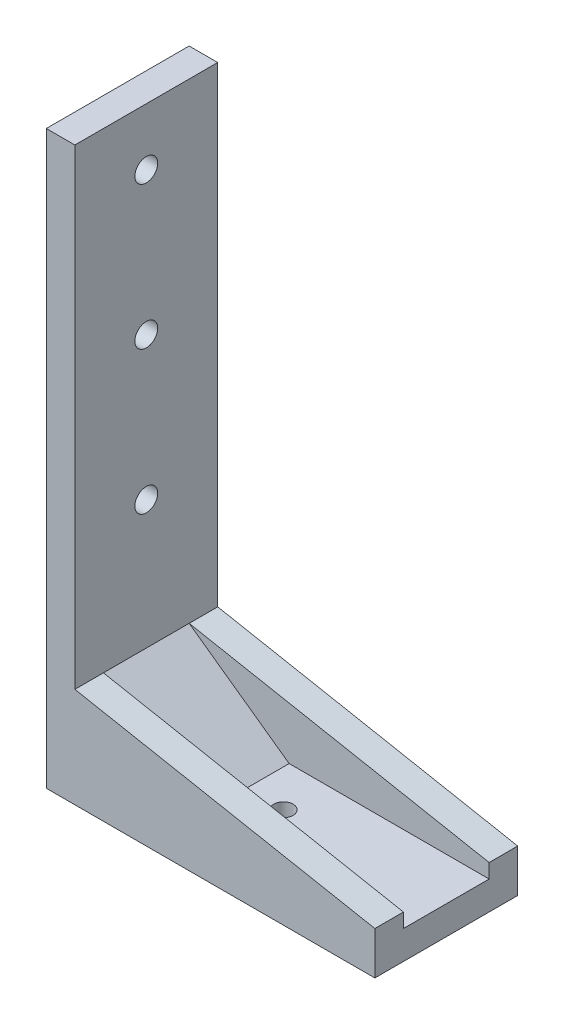
ISO-10303-21;
HEADER;
FILE_DESCRIPTION(('STEP AP214'),'2;1');
FILE_NAME('part.step','',(''),(''),'','','');
FILE_SCHEMA(('AUTOMOTIVE_DESIGN { 1 0 10303 214 1 1 1 1 }'));
ENDSEC;
DATA;
#1=APPLICATION_CONTEXT('core data for automotive mechanical design processes');
#2=APPLICATION_PROTOCOL_DEFINITION('international standard','automotive_design',2000,#1);
#3=PRODUCT_CONTEXT('',#1,'mechanical');
#4=PRODUCT('Part','Part','',(#3));
#5=PRODUCT_RELATED_PRODUCT_CATEGORY('part','',(#4));
#6=PRODUCT_DEFINITION_FORMATION('','',#4);
#7=PRODUCT_DEFINITION_CONTEXT('part definition',#1,'design');
#8=PRODUCT_DEFINITION('design','',#6,#7);
#9=PRODUCT_DEFINITION_SHAPE('','',#8);
#10=(LENGTH_UNIT() NAMED_UNIT(*) SI_UNIT(.MILLI.,.METRE.));
#11=(NAMED_UNIT(*) PLANE_ANGLE_UNIT() SI_UNIT($,.RADIAN.));
#12=(NAMED_UNIT(*) SI_UNIT($,.STERADIAN.) SOLID_ANGLE_UNIT());
#13=UNCERTAINTY_MEASURE_WITH_UNIT(LENGTH_MEASURE(1.E-05),#10,'distance_accuracy_value','');
#14=(GEOMETRIC_REPRESENTATION_CONTEXT(3) GLOBAL_UNCERTAINTY_ASSIGNED_CONTEXT((#13)) GLOBAL_UNIT_ASSIGNED_CONTEXT((#10,
#11,#12)) REPRESENTATION_CONTEXT('',''));
#15=CARTESIAN_POINT('',(0.,0.,0.));
#16=DIRECTION('',(0.,0.,1.));
#17=DIRECTION('',(1.,0.,0.));
#18=AXIS2_PLACEMENT_3D('',#15,#16,#17);
#19=CARTESIAN_POINT('',(0.,0.,25.));
#20=DIRECTION('',(0.,1.,0.));
#21=DIRECTION('',(0.,0.,1.));
#22=AXIS2_PLACEMENT_3D('',#19,#20,#21);
#23=PLANE('',#22);
#24=CARTESIAN_POINT('',(57.9999999999991,0.,-3.18807500671113E-13));
#25=DIRECTION('',(0.,-1.,0.));
#26=DIRECTION('',(0.,0.,-1.));
#27=AXIS2_PLACEMENT_3D('',#24,#25,#26);
#28=CIRCLE('',#27,3.39999999999998);
#29=CARTESIAN_POINT('',(57.9999999999991,0.,-3.4000000000003));
#30=VERTEX_POINT('',#29);
#31=EDGE_CURVE('E152',#30,#30,#28,.T.);
#32=ORIENTED_EDGE('',*,*,#31,.F.);
#33=EDGE_LOOP('',(#32));
#34=FACE_BOUND('',#33,.T.);
#35=DIRECTION('',(1.,0.,0.));
#36=VECTOR('',#35,1.);
#37=CARTESIAN_POINT('',(0.,0.,-25.));
#38=LINE('',#37,#36);
#39=CARTESIAN_POINT('',(0.,0.,-25.));
#40=VERTEX_POINT('',#39);
#41=CARTESIAN_POINT('',(115.,0.,-25.));
#42=VERTEX_POINT('',#41);
#43=EDGE_CURVE('E162',#40,#42,#38,.T.);
#44=ORIENTED_EDGE('',*,*,#43,.T.);
#45=DIRECTION('',(0.,0.,-1.));
#46=VECTOR('',#45,1.);
#47=CARTESIAN_POINT('',(115.,0.,25.));
#48=LINE('',#47,#46);
#49=CARTESIAN_POINT('',(115.,0.,25.));
#50=VERTEX_POINT('',#49);
#51=EDGE_CURVE('E208',#50,#42,#48,.T.);
#52=ORIENTED_EDGE('',*,*,#51,.F.);
#53=DIRECTION('',(1.,0.,0.));
#54=VECTOR('',#53,1.);
#55=CARTESIAN_POINT('',(0.,0.,25.));
#56=LINE('',#55,#54);
#57=CARTESIAN_POINT('',(0.,0.,25.));
#58=VERTEX_POINT('',#57);
#59=EDGE_CURVE('E177',#58,#50,#56,.T.);
#60=ORIENTED_EDGE('',*,*,#59,.F.);
#61=DIRECTION('',(0.,0.,-1.));
#62=VECTOR('',#61,1.);
#63=CARTESIAN_POINT('',(0.,0.,25.));
#64=LINE('',#63,#62);
#65=EDGE_CURVE('E189',#58,#40,#64,.T.);
#66=ORIENTED_EDGE('',*,*,#65,.T.);
#67=EDGE_LOOP('',(#44,#52,#60,#66));
#68=FACE_BOUND('',#67,.T.);
#69=ADVANCED_FACE('F33',(#34,#68),#23,.F.);
#70=CARTESIAN_POINT('',(115.,0.,25.));
#71=DIRECTION('',(-1.,0.,0.));
#72=DIRECTION('',(0.,0.,1.));
#73=AXIS2_PLACEMENT_3D('',#70,#71,#72);
#74=PLANE('',#73);
#75=DIRECTION('',(0.,1.,0.));
#76=VECTOR('',#75,1.);
#77=CARTESIAN_POINT('',(115.,0.,-25.));
#78=LINE('',#77,#76);
#79=CARTESIAN_POINT('',(115.,15.,-25.));
#80=VERTEX_POINT('',#79);
#81=EDGE_CURVE('E192',#42,#80,#78,.T.);
#82=ORIENTED_EDGE('',*,*,#81,.T.);
#83=DIRECTION('',(0.,0.,-1.));
#84=VECTOR('',#83,1.);
#85=CARTESIAN_POINT('',(115.,15.,-15.));
#86=LINE('',#85,#84);
#87=CARTESIAN_POINT('',(115.,15.,-15.));
#88=VERTEX_POINT('',#87);
#89=EDGE_CURVE('E139',#88,#80,#86,.T.);
#90=ORIENTED_EDGE('',*,*,#89,.F.);
#91=DIRECTION('',(0.,-1.,0.));
#92=VECTOR('',#91,1.);
#93=CARTESIAN_POINT('',(115.,10.,-15.));
#94=LINE('',#93,#92);
#95=CARTESIAN_POINT('',(115.,10.,-15.));
#96=VERTEX_POINT('',#95);
#97=EDGE_CURVE('E135',#88,#96,#94,.T.);
#98=ORIENTED_EDGE('',*,*,#97,.T.);
#99=DIRECTION('',(0.,0.,-1.));
#100=VECTOR('',#99,1.);
#101=CARTESIAN_POINT('',(115.,10.,25.));
#102=LINE('',#101,#100);
#103=CARTESIAN_POINT('',(115.,10.,15.));
#104=VERTEX_POINT('',#103);
#105=EDGE_CURVE('E114',#104,#96,#102,.T.);
#106=ORIENTED_EDGE('',*,*,#105,.F.);
#107=DIRECTION('',(0.,-1.,0.));
#108=VECTOR('',#107,1.);
#109=CARTESIAN_POINT('',(115.,10.,15.));
#110=LINE('',#109,#108);
#111=CARTESIAN_POINT('',(115.,15.,15.));
#112=VERTEX_POINT('',#111);
#113=EDGE_CURVE('E107',#112,#104,#110,.T.);
#114=ORIENTED_EDGE('',*,*,#113,.F.);
#115=DIRECTION('',(0.,0.,1.));
#116=VECTOR('',#115,1.);
#117=CARTESIAN_POINT('',(115.,15.,15.));
#118=LINE('',#117,#116);
#119=CARTESIAN_POINT('',(115.,15.,25.));
#120=VERTEX_POINT('',#119);
#121=EDGE_CURVE('E111',#112,#120,#118,.T.);
#122=ORIENTED_EDGE('',*,*,#121,.T.);
#123=DIRECTION('',(0.,1.,0.));
#124=VECTOR('',#123,1.);
#125=CARTESIAN_POINT('',(115.,0.,25.));
#126=LINE('',#125,#124);
#127=EDGE_CURVE('E180',#50,#120,#126,.T.);
#128=ORIENTED_EDGE('',*,*,#127,.F.);
#129=ORIENTED_EDGE('',*,*,#51,.T.);
#130=EDGE_LOOP('',(#82,#90,#98,#106,#114,#122,#128,#129));
#131=FACE_BOUND('',#130,.T.);
#132=ADVANCED_FACE('F109',(#131),#74,.F.);
#133=CARTESIAN_POINT('',(115.,10.,25.));
#134=DIRECTION('',(0.,-1.,0.));
#135=DIRECTION('',(1.,0.,0.));
#136=AXIS2_PLACEMENT_3D('',#133,#134,#135);
#137=PLANE('',#136);
#138=CARTESIAN_POINT('',(57.9999999999991,10.,-3.18807500671113E-13));
#139=DIRECTION('',(0.,-1.,0.));
#140=DIRECTION('',(1.,0.,0.));
#141=AXIS2_PLACEMENT_3D('',#138,#139,#140);
#142=CIRCLE('',#141,3.39999999999998);
#143=CARTESIAN_POINT('',(57.9999999999991,10.,-3.4000000000003));
#144=VERTEX_POINT('',#143);
#145=EDGE_CURVE('E155',#144,#144,#142,.F.);
#146=ORIENTED_EDGE('',*,*,#145,.F.);
#147=EDGE_LOOP('',(#146));
#148=FACE_BOUND('',#147,.T.);
#149=DIRECTION('',(0.,0.,-1.));
#150=VECTOR('',#149,1.);
#151=CARTESIAN_POINT('',(45.,10.,68.0116263352131));
#152=LINE('',#151,#150);
#153=CARTESIAN_POINT('',(45.,10.,15.));
#154=VERTEX_POINT('',#153);
#155=CARTESIAN_POINT('',(45.,10.,-15.));
#156=VERTEX_POINT('',#155);
#157=EDGE_CURVE('E150',#154,#156,#152,.T.);
#158=ORIENTED_EDGE('',*,*,#157,.F.);
#159=DIRECTION('',(-1.,0.,0.));
#160=VECTOR('',#159,1.);
#161=CARTESIAN_POINT('',(115.,10.,15.));
#162=LINE('',#161,#160);
#163=EDGE_CURVE('E47',#104,#154,#162,.T.);
#164=ORIENTED_EDGE('',*,*,#163,.F.);
#165=ORIENTED_EDGE('',*,*,#105,.T.);
#166=DIRECTION('',(-1.,0.,0.));
#167=VECTOR('',#166,1.);
#168=CARTESIAN_POINT('',(115.,10.,-15.));
#169=LINE('',#168,#167);
#170=EDGE_CURVE('E137',#96,#156,#169,.T.);
#171=ORIENTED_EDGE('',*,*,#170,.T.);
#172=EDGE_LOOP('',(#158,#164,#165,#171));
#173=FACE_BOUND('',#172,.T.);
#174=ADVANCED_FACE('F217',(#148,#173),#137,.F.);
#175=CARTESIAN_POINT('',(10.,9.99999999999999,25.));
#176=DIRECTION('',(-1.,0.,0.));
#177=DIRECTION('',(0.,0.,1.));
#178=AXIS2_PLACEMENT_3D('',#175,#176,#177);
#179=PLANE('',#178);
#180=CARTESIAN_POINT('',(10.,180.,0.));
#181=DIRECTION('',(1.,0.,0.));
#182=DIRECTION('',(0.,0.,-1.));
#183=AXIS2_PLACEMENT_3D('',#180,#181,#182);
#184=CIRCLE('',#183,4.);
#185=CARTESIAN_POINT('',(10.,180.,-4.));
#186=VERTEX_POINT('',#185);
#187=EDGE_CURVE('E163',#186,#186,#184,.T.);
#188=ORIENTED_EDGE('',*,*,#187,.F.);
#189=EDGE_LOOP('',(#188));
#190=FACE_BOUND('',#189,.T.);
#191=CARTESIAN_POINT('',(10.,130.,0.));
#192=DIRECTION('',(1.,0.,0.));
#193=DIRECTION('',(0.,0.,-1.));
#194=AXIS2_PLACEMENT_3D('',#191,#192,#193);
#195=CIRCLE('',#194,4.);
#196=CARTESIAN_POINT('',(10.,130.,-4.));
#197=VERTEX_POINT('',#196);
#198=EDGE_CURVE('E169',#197,#197,#195,.T.);
#199=ORIENTED_EDGE('',*,*,#198,.F.);
#200=EDGE_LOOP('',(#199));
#201=FACE_BOUND('',#200,.T.);
#202=CARTESIAN_POINT('',(10.,80.,0.));
#203=DIRECTION('',(1.,0.,0.));
#204=DIRECTION('',(0.,0.,-1.));
#205=AXIS2_PLACEMENT_3D('',#202,#203,#204);
#206=CIRCLE('',#205,4.);
#207=CARTESIAN_POINT('',(10.,80.,-4.));
#208=VERTEX_POINT('',#207);
#209=EDGE_CURVE('E158',#208,#208,#206,.T.);
#210=ORIENTED_EDGE('',*,*,#209,.F.);
#211=EDGE_LOOP('',(#210));
#212=FACE_BOUND('',#211,.T.);
#213=DIRECTION('',(0.,1.,0.));
#214=VECTOR('',#213,1.);
#215=CARTESIAN_POINT('',(10.,9.99999999999999,25.));
#216=LINE('',#215,#214);
#217=CARTESIAN_POINT('',(10.,35.,25.));
#218=VERTEX_POINT('',#217);
#219=CARTESIAN_POINT('',(10.,200.,25.));
#220=VERTEX_POINT('',#219);
#221=EDGE_CURVE('E183',#218,#220,#216,.T.);
#222=ORIENTED_EDGE('',*,*,#221,.F.);
#223=DIRECTION('',(0.,0.,-1.));
#224=VECTOR('',#223,1.);
#225=CARTESIAN_POINT('',(10.,35.,68.0116263352131));
#226=LINE('',#225,#224);
#227=CARTESIAN_POINT('',(10.,35.,15.));
#228=VERTEX_POINT('',#227);
#229=EDGE_CURVE('E147',#218,#228,#226,.T.);
#230=ORIENTED_EDGE('',*,*,#229,.T.);
#231=CARTESIAN_POINT('',(10.,35.,-15.));
#232=VERTEX_POINT('',#231);
#233=EDGE_CURVE('E144',#228,#232,#226,.T.);
#234=ORIENTED_EDGE('',*,*,#233,.T.);
#235=DIRECTION('',(0.,0.,-1.));
#236=VECTOR('',#235,1.);
#237=CARTESIAN_POINT('',(10.,35.,-15.));
#238=LINE('',#237,#236);
#239=CARTESIAN_POINT('',(10.,35.,-25.));
#240=VERTEX_POINT('',#239);
#241=EDGE_CURVE('E141',#232,#240,#238,.T.);
#242=ORIENTED_EDGE('',*,*,#241,.T.);
#243=DIRECTION('',(0.,1.,0.));
#244=VECTOR('',#243,1.);
#245=CARTESIAN_POINT('',(10.,9.99999999999999,-25.));
#246=LINE('',#245,#244);
#247=CARTESIAN_POINT('',(10.,200.,-25.));
#248=VERTEX_POINT('',#247);
#249=EDGE_CURVE('E194',#240,#248,#246,.T.);
#250=ORIENTED_EDGE('',*,*,#249,.T.);
#251=DIRECTION('',(0.,0.,-1.));
#252=VECTOR('',#251,1.);
#253=CARTESIAN_POINT('',(10.,200.,25.));
#254=LINE('',#253,#252);
#255=EDGE_CURVE('E204',#220,#248,#254,.T.);
#256=ORIENTED_EDGE('',*,*,#255,.F.);
#257=EDGE_LOOP('',(#222,#230,#234,#242,#250,#256));
#258=FACE_BOUND('',#257,.T.);
#259=ADVANCED_FACE('F262',(#190,#201,#212,#258),#179,.F.);
#260=CARTESIAN_POINT('',(10.,200.,25.));
#261=DIRECTION('',(0.,-1.,0.));
#262=DIRECTION('',(0.,0.,-1.));
#263=AXIS2_PLACEMENT_3D('',#260,#261,#262);
#264=PLANE('',#263);
#265=DIRECTION('',(-1.,0.,0.));
#266=VECTOR('',#265,1.);
#267=CARTESIAN_POINT('',(10.,200.,-25.));
#268=LINE('',#267,#266);
#269=CARTESIAN_POINT('',(0.,200.,-25.));
#270=VERTEX_POINT('',#269);
#271=EDGE_CURVE('E196',#248,#270,#268,.T.);
#272=ORIENTED_EDGE('',*,*,#271,.T.);
#273=DIRECTION('',(0.,0.,-1.));
#274=VECTOR('',#273,1.);
#275=CARTESIAN_POINT('',(0.,200.,25.));
#276=LINE('',#275,#274);
#277=CARTESIAN_POINT('',(0.,200.,25.));
#278=VERTEX_POINT('',#277);
#279=EDGE_CURVE('E201',#278,#270,#276,.T.);
#280=ORIENTED_EDGE('',*,*,#279,.F.);
#281=DIRECTION('',(-1.,0.,0.));
#282=VECTOR('',#281,1.);
#283=CARTESIAN_POINT('',(10.,200.,25.));
#284=LINE('',#283,#282);
#285=EDGE_CURVE('E185',#220,#278,#284,.T.);
#286=ORIENTED_EDGE('',*,*,#285,.F.);
#287=ORIENTED_EDGE('',*,*,#255,.T.);
#288=EDGE_LOOP('',(#272,#280,#286,#287));
#289=FACE_BOUND('',#288,.T.);
#290=ADVANCED_FACE('F259',(#289),#264,.F.);
#291=CARTESIAN_POINT('',(0.,0.,25.));
#292=DIRECTION('',(1.,0.,0.));
#293=DIRECTION('',(0.,0.,-1.));
#294=AXIS2_PLACEMENT_3D('',#291,#292,#293);
#295=PLANE('',#294);
#296=CARTESIAN_POINT('',(0.,180.,0.));
#297=DIRECTION('',(1.,0.,0.));
#298=DIRECTION('',(0.,0.,-1.));
#299=AXIS2_PLACEMENT_3D('',#296,#297,#298);
#300=CIRCLE('',#299,4.);
#301=CARTESIAN_POINT('',(0.,180.,-4.));
#302=VERTEX_POINT('',#301);
#303=EDGE_CURVE('E159',#302,#302,#300,.T.);
#304=ORIENTED_EDGE('',*,*,#303,.T.);
#305=EDGE_LOOP('',(#304));
#306=FACE_BOUND('',#305,.T.);
#307=CARTESIAN_POINT('',(0.,130.,0.));
#308=DIRECTION('',(1.,0.,0.));
#309=DIRECTION('',(0.,0.,-1.));
#310=AXIS2_PLACEMENT_3D('',#307,#308,#309);
#311=CIRCLE('',#310,4.);
#312=CARTESIAN_POINT('',(0.,130.,-4.));
#313=VERTEX_POINT('',#312);
#314=EDGE_CURVE('E166',#313,#313,#311,.T.);
#315=ORIENTED_EDGE('',*,*,#314,.T.);
#316=EDGE_LOOP('',(#315));
#317=FACE_BOUND('',#316,.T.);
#318=CARTESIAN_POINT('',(0.,80.,0.));
#319=DIRECTION('',(1.,0.,0.));
#320=DIRECTION('',(0.,0.,-1.));
#321=AXIS2_PLACEMENT_3D('',#318,#319,#320);
#322=CIRCLE('',#321,4.);
#323=CARTESIAN_POINT('',(0.,80.,-4.));
#324=VERTEX_POINT('',#323);
#325=EDGE_CURVE('E172',#324,#324,#322,.T.);
#326=ORIENTED_EDGE('',*,*,#325,.T.);
#327=EDGE_LOOP('',(#326));
#328=FACE_BOUND('',#327,.T.);
#329=DIRECTION('',(0.,-1.,0.));
#330=VECTOR('',#329,1.);
#331=CARTESIAN_POINT('',(0.,0.,-25.));
#332=LINE('',#331,#330);
#333=EDGE_CURVE('E181',#270,#40,#332,.T.);
#334=ORIENTED_EDGE('',*,*,#333,.T.);
#335=ORIENTED_EDGE('',*,*,#65,.F.);
#336=DIRECTION('',(0.,-1.,0.));
#337=VECTOR('',#336,1.);
#338=CARTESIAN_POINT('',(0.,0.,25.));
#339=LINE('',#338,#337);
#340=EDGE_CURVE('E187',#278,#58,#339,.T.);
#341=ORIENTED_EDGE('',*,*,#340,.F.);
#342=ORIENTED_EDGE('',*,*,#279,.T.);
#343=EDGE_LOOP('',(#334,#335,#341,#342));
#344=FACE_BOUND('',#343,.T.);
#345=ADVANCED_FACE('F257',(#306,#317,#328,#344),#295,.F.);
#346=CARTESIAN_POINT('',(0.,0.,25.));
#347=DIRECTION('',(0.,0.,1.));
#348=DIRECTION('',(1.,0.,0.));
#349=AXIS2_PLACEMENT_3D('',#346,#347,#348);
#350=PLANE('',#349);
#351=ORIENTED_EDGE('',*,*,#127,.T.);
#352=DIRECTION('',(0.982338566422475,-0.187112107889995,0.));
#353=VECTOR('',#352,1.);
#354=CARTESIAN_POINT('',(10.,35.,25.));
#355=LINE('',#354,#353);
#356=EDGE_CURVE('E122',#218,#120,#355,.T.);
#357=ORIENTED_EDGE('',*,*,#356,.F.);
#358=ORIENTED_EDGE('',*,*,#221,.T.);
#359=ORIENTED_EDGE('',*,*,#285,.T.);
#360=ORIENTED_EDGE('',*,*,#340,.T.);
#361=ORIENTED_EDGE('',*,*,#59,.T.);
#362=EDGE_LOOP('',(#351,#357,#358,#359,#360,#361));
#363=FACE_BOUND('',#362,.T.);
#364=ADVANCED_FACE('F252',(#363),#350,.T.);
#365=CARTESIAN_POINT('',(0.,0.,-25.));
#366=DIRECTION('',(0.,0.,1.));
#367=DIRECTION('',(1.,0.,0.));
#368=AXIS2_PLACEMENT_3D('',#365,#366,#367);
#369=PLANE('',#368);
#370=ORIENTED_EDGE('',*,*,#249,.F.);
#371=DIRECTION('',(0.982338566422475,-0.187112107889995,0.));
#372=VECTOR('',#371,1.);
#373=CARTESIAN_POINT('',(10.,35.,-25.));
#374=LINE('',#373,#372);
#375=EDGE_CURVE('E126',#240,#80,#374,.T.);
#376=ORIENTED_EDGE('',*,*,#375,.T.);
#377=ORIENTED_EDGE('',*,*,#81,.F.);
#378=ORIENTED_EDGE('',*,*,#43,.F.);
#379=ORIENTED_EDGE('',*,*,#333,.F.);
#380=ORIENTED_EDGE('',*,*,#271,.F.);
#381=EDGE_LOOP('',(#370,#376,#377,#378,#379,#380));
#382=FACE_BOUND('',#381,.T.);
#383=ADVANCED_FACE('F249',(#382),#369,.F.);
#384=CARTESIAN_POINT('',(0.,80.,0.));
#385=DIRECTION('',(1.,0.,0.));
#386=DIRECTION('',(0.,0.,-1.));
#387=AXIS2_PLACEMENT_3D('',#384,#385,#386);
#388=CYLINDRICAL_SURFACE('',#387,4.);
#389=ORIENTED_EDGE('',*,*,#325,.F.);
#390=EDGE_LOOP('',(#389));
#391=FACE_BOUND('',#390,.T.);
#392=ORIENTED_EDGE('',*,*,#209,.T.);
#393=EDGE_LOOP('',(#392));
#394=FACE_BOUND('',#393,.T.);
#395=ADVANCED_FACE('F282',(#391,#394),#388,.F.);
#396=CARTESIAN_POINT('',(0.,130.,0.));
#397=DIRECTION('',(1.,0.,0.));
#398=DIRECTION('',(0.,0.,-1.));
#399=AXIS2_PLACEMENT_3D('',#396,#397,#398);
#400=CYLINDRICAL_SURFACE('',#399,4.);
#401=ORIENTED_EDGE('',*,*,#314,.F.);
#402=EDGE_LOOP('',(#401));
#403=FACE_BOUND('',#402,.T.);
#404=ORIENTED_EDGE('',*,*,#198,.T.);
#405=EDGE_LOOP('',(#404));
#406=FACE_BOUND('',#405,.T.);
#407=ADVANCED_FACE('F287',(#403,#406),#400,.F.);
#408=CARTESIAN_POINT('',(0.,180.,0.));
#409=DIRECTION('',(1.,0.,0.));
#410=DIRECTION('',(0.,0.,-1.));
#411=AXIS2_PLACEMENT_3D('',#408,#409,#410);
#412=CYLINDRICAL_SURFACE('',#411,4.);
#413=ORIENTED_EDGE('',*,*,#303,.F.);
#414=EDGE_LOOP('',(#413));
#415=FACE_BOUND('',#414,.T.);
#416=ORIENTED_EDGE('',*,*,#187,.T.);
#417=EDGE_LOOP('',(#416));
#418=FACE_BOUND('',#417,.T.);
#419=ADVANCED_FACE('F231',(#415,#418),#412,.F.);
#420=CARTESIAN_POINT('',(57.9999999999991,200.001,-3.18807500671113E-13));
#421=DIRECTION('',(0.,-1.,0.));
#422=DIRECTION('',(0.,0.,-1.));
#423=AXIS2_PLACEMENT_3D('',#420,#421,#422);
#424=CYLINDRICAL_SURFACE('',#423,3.39999999999998);
#425=CARTESIAN_POINT('',(57.9999999999991,0.,-3.4000000000003));
#426=CARTESIAN_POINT('',(57.9999999999991,0.104166666666664,-3.4000000000003));
#427=CARTESIAN_POINT('',(57.9999999999991,0.208333333333329,-3.4000000000003));
#428=CARTESIAN_POINT('',(57.9999999999991,0.416666666666658,-3.4000000000003));
#429=CARTESIAN_POINT('',(57.9999999999991,0.520833333333322,-3.4000000000003));
#430=CARTESIAN_POINT('',(57.9999999999991,0.72916666666666,-3.4000000000003));
#431=CARTESIAN_POINT('',(57.9999999999991,0.833333333333334,-3.4000000000003));
#432=CARTESIAN_POINT('',(57.9999999999991,1.04166666666667,-3.4000000000003));
#433=CARTESIAN_POINT('',(57.9999999999991,1.14583333333334,-3.4000000000003));
#434=CARTESIAN_POINT('',(57.9999999999991,1.35416666666667,-3.4000000000003));
#435=CARTESIAN_POINT('',(57.9999999999991,1.45833333333333,-3.4000000000003));
#436=CARTESIAN_POINT('',(57.9999999999991,1.66666666666667,-3.4000000000003));
#437=CARTESIAN_POINT('',(57.9999999999991,1.77083333333334,-3.4000000000003));
#438=CARTESIAN_POINT('',(57.9999999999991,1.97916666666668,-3.4000000000003));
#439=CARTESIAN_POINT('',(57.9999999999991,2.08333333333334,-3.4000000000003));
#440=CARTESIAN_POINT('',(57.9999999999991,2.29166666666667,-3.4000000000003));
#441=CARTESIAN_POINT('',(57.9999999999991,2.39583333333334,-3.4000000000003));
#442=CARTESIAN_POINT('',(57.9999999999991,2.60416666666667,-3.4000000000003));
#443=CARTESIAN_POINT('',(57.9999999999991,2.70833333333333,-3.4000000000003));
#444=CARTESIAN_POINT('',(57.9999999999991,2.91666666666666,-3.4000000000003));
#445=CARTESIAN_POINT('',(57.9999999999991,3.02083333333332,-3.4000000000003));
#446=CARTESIAN_POINT('',(57.9999999999991,3.22916666666666,-3.4000000000003));
#447=CARTESIAN_POINT('',(57.9999999999991,3.33333333333334,-3.4000000000003));
#448=CARTESIAN_POINT('',(57.9999999999991,3.54166666666667,-3.4000000000003));
#449=CARTESIAN_POINT('',(57.9999999999991,3.64583333333334,-3.4000000000003));
#450=CARTESIAN_POINT('',(57.9999999999991,3.85416666666667,-3.4000000000003));
#451=CARTESIAN_POINT('',(57.9999999999991,3.95833333333333,-3.4000000000003));
#452=CARTESIAN_POINT('',(57.9999999999991,4.16666666666667,-3.4000000000003));
#453=CARTESIAN_POINT('',(57.9999999999991,4.27083333333334,-3.4000000000003));
#454=CARTESIAN_POINT('',(57.9999999999991,4.47916666666668,-3.4000000000003));
#455=CARTESIAN_POINT('',(57.9999999999991,4.58333333333335,-3.4000000000003));
#456=CARTESIAN_POINT('',(57.9999999999991,4.79166666666668,-3.4000000000003));
#457=CARTESIAN_POINT('',(57.9999999999991,4.89583333333334,-3.4000000000003));
#458=CARTESIAN_POINT('',(57.9999999999991,5.10416666666667,-3.4000000000003));
#459=CARTESIAN_POINT('',(57.9999999999991,5.20833333333333,-3.4000000000003));
#460=CARTESIAN_POINT('',(57.9999999999991,5.41666666666666,-3.4000000000003));
#461=CARTESIAN_POINT('',(57.9999999999991,5.52083333333333,-3.4000000000003));
#462=CARTESIAN_POINT('',(57.9999999999991,5.72916666666666,-3.4000000000003));
#463=CARTESIAN_POINT('',(57.9999999999991,5.83333333333334,-3.4000000000003));
#464=CARTESIAN_POINT('',(57.9999999999991,6.04166666666668,-3.4000000000003));
#465=CARTESIAN_POINT('',(57.9999999999991,6.14583333333334,-3.4000000000003));
#466=CARTESIAN_POINT('',(57.9999999999991,6.35416666666667,-3.4000000000003));
#467=CARTESIAN_POINT('',(57.9999999999991,6.45833333333333,-3.4000000000003));
#468=CARTESIAN_POINT('',(57.9999999999991,6.66666666666667,-3.4000000000003));
#469=CARTESIAN_POINT('',(57.9999999999991,6.77083333333335,-3.4000000000003));
#470=CARTESIAN_POINT('',(57.9999999999991,6.97916666666668,-3.4000000000003));
#471=CARTESIAN_POINT('',(57.9999999999991,7.08333333333335,-3.4000000000003));
#472=CARTESIAN_POINT('',(57.9999999999991,7.29166666666668,-3.4000000000003));
#473=CARTESIAN_POINT('',(57.9999999999991,7.39583333333334,-3.4000000000003));
#474=CARTESIAN_POINT('',(57.9999999999991,7.60416666666667,-3.4000000000003));
#475=CARTESIAN_POINT('',(57.9999999999991,7.70833333333334,-3.4000000000003));
#476=CARTESIAN_POINT('',(57.9999999999991,7.91666666666666,-3.4000000000003));
#477=CARTESIAN_POINT('',(57.9999999999991,8.02083333333333,-3.4000000000003));
#478=CARTESIAN_POINT('',(57.9999999999991,8.22916666666667,-3.4000000000003));
#479=CARTESIAN_POINT('',(57.9999999999991,8.33333333333334,-3.4000000000003));
#480=CARTESIAN_POINT('',(57.9999999999991,8.54166666666668,-3.4000000000003));
#481=CARTESIAN_POINT('',(57.9999999999991,8.64583333333334,-3.4000000000003));
#482=CARTESIAN_POINT('',(57.9999999999991,8.85416666666667,-3.4000000000003));
#483=CARTESIAN_POINT('',(57.9999999999991,8.95833333333334,-3.4000000000003));
#484=CARTESIAN_POINT('',(57.9999999999991,9.16666666666667,-3.4000000000003));
#485=CARTESIAN_POINT('',(57.9999999999991,9.27083333333335,-3.4000000000003));
#486=CARTESIAN_POINT('',(57.9999999999991,9.47916666666669,-3.4000000000003));
#487=CARTESIAN_POINT('',(57.9999999999991,9.58333333333335,-3.4000000000003));
#488=CARTESIAN_POINT('',(57.9999999999991,9.79166666666668,-3.4000000000003));
#489=CARTESIAN_POINT('',(57.9999999999991,9.89583333333334,-3.4000000000003));
#490=CARTESIAN_POINT('',(57.9999999999991,10.,-3.4000000000003));
#491=B_SPLINE_CURVE_WITH_KNOTS('',3,(#425,#426,#427,#428,#429,#430,#431,#432,#433,#434,#435,
#436,#437,#438,#439,#440,#441,#442,#443,#444,#445,#446,#447,#448,#449,#450,#451,#452,#453,#454,
#455,#456,#457,#458,#459,#460,#461,#462,#463,#464,#465,#466,#467,#468,#469,#470,#471,#472,#473,
#474,#475,#476,#477,#478,#479,#480,#481,#482,#483,#484,#485,#486,#487,#488,#489,#490),
.UNSPECIFIED.,.F.,.F.,(4,2,2,2,2,2,2,2,2,2,2,2,2,2,2,2,2,2,2,2,2,2,2,2,2,2,2,2,2,2,2,2,4),(0.,
0.312499999999993,0.624999999999987,0.937500000000008,1.25,1.56249999999999,1.87500000000002,
2.18750000000001,2.5,2.8125,3.12499999999999,3.43750000000001,3.75,4.0625,4.37500000000002,
4.68750000000001,5.,5.3125,5.62499999999999,5.93750000000001,6.25000000000001,6.5625,
6.87500000000002,7.18750000000001,7.50000000000001,7.8125,8.12499999999999,8.43750000000001,
8.75000000000001,9.0625,9.37500000000002,9.68750000000002,10.),.UNSPECIFIED.);
#492=EDGE_CURVE('BSEAM222',#30,#144,#491,.T.);
#493=ORIENTED_EDGE('',*,*,#31,.T.);
#494=ORIENTED_EDGE('',*,*,#145,.T.);
#495=ORIENTED_EDGE('',*,*,#492,.T.);
#496=ORIENTED_EDGE('',*,*,#492,.F.);
#497=EDGE_LOOP('',(#493,#495,#494,#496));
#498=FACE_BOUND('',#497,.T.);
#499=ADVANCED_FACE('F222',(#498),#424,.F.);
#500=CARTESIAN_POINT('',(10.,35.,68.0116263352131));
#501=DIRECTION('',(0.581238193719096,0.813733471206735,0.));
#502=DIRECTION('',(-0.813733471206735,0.581238193719096,0.));
#503=AXIS2_PLACEMENT_3D('',#500,#501,#502);
#504=PLANE('',#503);
#505=DIRECTION('',(-0.813733471206735,0.581238193719096,0.));
#506=VECTOR('',#505,1.);
#507=CARTESIAN_POINT('',(10.,35.,15.));
#508=LINE('',#507,#506);
#509=EDGE_CURVE('E11',#154,#228,#508,.T.);
#510=ORIENTED_EDGE('',*,*,#509,.F.);
#511=ORIENTED_EDGE('',*,*,#157,.T.);
#512=DIRECTION('',(0.813733471206735,-0.581238193719096,0.));
#513=VECTOR('',#512,1.);
#514=CARTESIAN_POINT('',(10.,35.,-15.));
#515=LINE('',#514,#513);
#516=EDGE_CURVE('E40',#232,#156,#515,.T.);
#517=ORIENTED_EDGE('',*,*,#516,.F.);
#518=ORIENTED_EDGE('',*,*,#233,.F.);
#519=EDGE_LOOP('',(#510,#511,#517,#518));
#520=FACE_BOUND('',#519,.T.);
#521=ADVANCED_FACE('F219',(#520),#504,.T.);
#522=CARTESIAN_POINT('',(10.,35.,-15.));
#523=DIRECTION('',(0.187112107889995,0.982338566422475,0.));
#524=DIRECTION('',(-0.982338566422475,0.187112107889995,0.));
#525=AXIS2_PLACEMENT_3D('',#522,#523,#524);
#526=PLANE('',#525);
#527=ORIENTED_EDGE('',*,*,#375,.F.);
#528=ORIENTED_EDGE('',*,*,#241,.F.);
#529=DIRECTION('',(0.982338566422475,-0.187112107889995,0.));
#530=VECTOR('',#529,1.);
#531=CARTESIAN_POINT('',(10.,35.,-15.));
#532=LINE('',#531,#530);
#533=EDGE_CURVE('E129',#232,#88,#532,.T.);
#534=ORIENTED_EDGE('',*,*,#533,.T.);
#535=ORIENTED_EDGE('',*,*,#89,.T.);
#536=EDGE_LOOP('',(#527,#528,#534,#535));
#537=FACE_BOUND('',#536,.T.);
#538=ADVANCED_FACE('F221',(#537),#526,.T.);
#539=CARTESIAN_POINT('',(0.,0.,-15.));
#540=DIRECTION('',(0.,0.,1.));
#541=DIRECTION('',(1.,0.,0.));
#542=AXIS2_PLACEMENT_3D('',#539,#540,#541);
#543=PLANE('',#542);
#544=ORIENTED_EDGE('',*,*,#533,.F.);
#545=ORIENTED_EDGE('',*,*,#516,.T.);
#546=ORIENTED_EDGE('',*,*,#170,.F.);
#547=ORIENTED_EDGE('',*,*,#97,.F.);
#548=EDGE_LOOP('',(#544,#545,#546,#547));
#549=FACE_BOUND('',#548,.T.);
#550=ADVANCED_FACE('F215',(#549),#543,.T.);
#551=CARTESIAN_POINT('',(10.,35.,15.));
#552=DIRECTION('',(-0.187112107889995,-0.982338566422475,0.));
#553=DIRECTION('',(0.982338566422475,-0.187112107889995,0.));
#554=AXIS2_PLACEMENT_3D('',#551,#552,#553);
#555=PLANE('',#554);
#556=ORIENTED_EDGE('',*,*,#356,.T.);
#557=ORIENTED_EDGE('',*,*,#121,.F.);
#558=DIRECTION('',(0.982338566422475,-0.187112107889995,0.));
#559=VECTOR('',#558,1.);
#560=CARTESIAN_POINT('',(10.,35.,15.));
#561=LINE('',#560,#559);
#562=EDGE_CURVE('E118',#228,#112,#561,.T.);
#563=ORIENTED_EDGE('',*,*,#562,.F.);
#564=ORIENTED_EDGE('',*,*,#229,.F.);
#565=EDGE_LOOP('',(#556,#557,#563,#564));
#566=FACE_BOUND('',#565,.T.);
#567=ADVANCED_FACE('F124',(#566),#555,.F.);
#568=CARTESIAN_POINT('',(0.,0.,15.));
#569=DIRECTION('',(0.,0.,-1.));
#570=DIRECTION('',(1.,0.,0.));
#571=AXIS2_PLACEMENT_3D('',#568,#569,#570);
#572=PLANE('',#571);
#573=ORIENTED_EDGE('',*,*,#163,.T.);
#574=ORIENTED_EDGE('',*,*,#509,.T.);
#575=ORIENTED_EDGE('',*,*,#562,.T.);
#576=ORIENTED_EDGE('',*,*,#113,.T.);
#577=EDGE_LOOP('',(#573,#574,#575,#576));
#578=FACE_BOUND('',#577,.T.);
#579=ADVANCED_FACE('F119',(#578),#572,.T.);
#580=CLOSED_SHELL('',(#69,#132,#174,#259,#290,#345,#364,#383,#395,#407,#419,#499,#521,#538,#550,
#567,#579));
#581=MANIFOLD_SOLID_BREP('B2',#580);
#582=ADVANCED_BREP_SHAPE_REPRESENTATION('',(#18,#581),#14);
#583=SHAPE_DEFINITION_REPRESENTATION(#9,#582);
ENDSEC;
END-ISO-10303-21;
